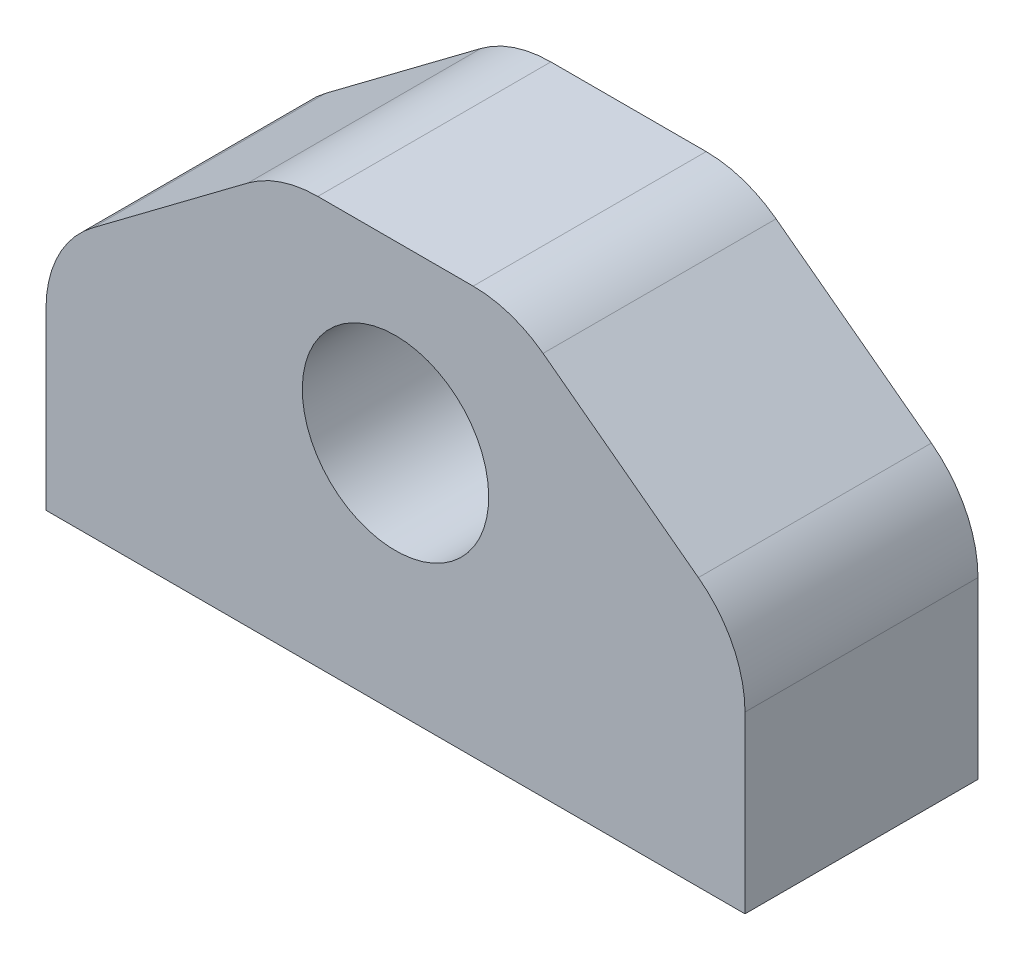
ISO-10303-21;
HEADER;
FILE_DESCRIPTION(('STEP AP214'),'2;1');
FILE_NAME('part.step','',(''),(''),'','','');
FILE_SCHEMA(('AUTOMOTIVE_DESIGN { 1 0 10303 214 1 1 1 1 }'));
ENDSEC;
DATA;
#1=APPLICATION_CONTEXT('core data for automotive mechanical design processes');
#2=APPLICATION_PROTOCOL_DEFINITION('international standard','automotive_design',2000,#1);
#3=PRODUCT_CONTEXT('',#1,'mechanical');
#4=PRODUCT('Part','Part','',(#3));
#5=PRODUCT_RELATED_PRODUCT_CATEGORY('part','',(#4));
#6=PRODUCT_DEFINITION_FORMATION('','',#4);
#7=PRODUCT_DEFINITION_CONTEXT('part definition',#1,'design');
#8=PRODUCT_DEFINITION('design','',#6,#7);
#9=PRODUCT_DEFINITION_SHAPE('','',#8);
#10=(LENGTH_UNIT() NAMED_UNIT(*) SI_UNIT(.MILLI.,.METRE.));
#11=(NAMED_UNIT(*) PLANE_ANGLE_UNIT() SI_UNIT($,.RADIAN.));
#12=(NAMED_UNIT(*) SI_UNIT($,.STERADIAN.) SOLID_ANGLE_UNIT());
#13=UNCERTAINTY_MEASURE_WITH_UNIT(LENGTH_MEASURE(1.E-05),#10,'distance_accuracy_value','');
#14=(GEOMETRIC_REPRESENTATION_CONTEXT(3) GLOBAL_UNCERTAINTY_ASSIGNED_CONTEXT((#13)) GLOBAL_UNIT_ASSIGNED_CONTEXT((#10,
#11,#12)) REPRESENTATION_CONTEXT('',''));
#15=CARTESIAN_POINT('',(0.,0.,0.));
#16=DIRECTION('',(0.,0.,1.));
#17=DIRECTION('',(1.,0.,0.));
#18=AXIS2_PLACEMENT_3D('',#15,#16,#17);
#19=CARTESIAN_POINT('',(-22.,20.,0.));
#20=DIRECTION('',(0.,1.,0.));
#21=DIRECTION('',(0.,0.,1.));
#22=AXIS2_PLACEMENT_3D('',#19,#20,#21);
#23=PLANE('',#22);
#24=CARTESIAN_POINT('',(-22.,20.,0.));
#25=DIRECTION('',(0.,-1.,0.));
#26=DIRECTION('',(0.,0.,-1.));
#27=AXIS2_PLACEMENT_3D('',#24,#25,#26);
#28=CIRCLE('',#27,3.00000000000001);
#29=CARTESIAN_POINT('',(-22.,20.,-3.00000000000001));
#30=VERTEX_POINT('',#29);
#31=EDGE_CURVE('E20',#30,#30,#28,.T.);
#32=ORIENTED_EDGE('',*,*,#31,.T.);
#33=EDGE_LOOP('',(#32));
#34=FACE_BOUND('',#33,.T.);
#35=ADVANCED_FACE('F17',(#34),#23,.F.);
#36=CARTESIAN_POINT('',(22.,20.,0.));
#37=DIRECTION('',(0.,1.,0.));
#38=DIRECTION('',(0.,0.,1.));
#39=AXIS2_PLACEMENT_3D('',#36,#37,#38);
#40=PLANE('',#39);
#41=CARTESIAN_POINT('',(22.,20.,0.));
#42=DIRECTION('',(0.,-1.,0.));
#43=DIRECTION('',(0.,0.,-1.));
#44=AXIS2_PLACEMENT_3D('',#41,#42,#43);
#45=CIRCLE('',#44,3.00000000000001);
#46=CARTESIAN_POINT('',(22.,20.,-3.00000000000001));
#47=VERTEX_POINT('',#46);
#48=EDGE_CURVE('E189',#47,#47,#45,.T.);
#49=ORIENTED_EDGE('',*,*,#48,.T.);
#50=EDGE_LOOP('',(#49));
#51=FACE_BOUND('',#50,.T.);
#52=ADVANCED_FACE('F201',(#51),#40,.F.);
#53=CARTESIAN_POINT('',(-22.,0.,0.));
#54=DIRECTION('',(0.,-1.,0.));
#55=DIRECTION('',(0.,0.,-1.));
#56=AXIS2_PLACEMENT_3D('',#53,#54,#55);
#57=CYLINDRICAL_SURFACE('',#56,3.00000000000001);
#58=ORIENTED_EDGE('',*,*,#31,.F.);
#59=EDGE_LOOP('',(#58));
#60=FACE_BOUND('',#59,.T.);
#61=CARTESIAN_POINT('',(-22.,0.,0.));
#62=DIRECTION('',(0.,-1.,0.));
#63=DIRECTION('',(0.,0.,-1.));
#64=AXIS2_PLACEMENT_3D('',#61,#62,#63);
#65=CIRCLE('',#64,3.00000000000001);
#66=CARTESIAN_POINT('',(-22.,0.,-3.00000000000001));
#67=VERTEX_POINT('',#66);
#68=EDGE_CURVE('E146',#67,#67,#65,.T.);
#69=ORIENTED_EDGE('',*,*,#68,.T.);
#70=EDGE_LOOP('',(#69));
#71=FACE_BOUND('',#70,.T.);
#72=ADVANCED_FACE('F197',(#60,#71),#57,.F.);
#73=CARTESIAN_POINT('',(22.,0.,0.));
#74=DIRECTION('',(0.,-1.,0.));
#75=DIRECTION('',(0.,0.,-1.));
#76=AXIS2_PLACEMENT_3D('',#73,#74,#75);
#77=CYLINDRICAL_SURFACE('',#76,3.00000000000001);
#78=ORIENTED_EDGE('',*,*,#48,.F.);
#79=EDGE_LOOP('',(#78));
#80=FACE_BOUND('',#79,.T.);
#81=CARTESIAN_POINT('',(22.,0.,0.));
#82=DIRECTION('',(0.,-1.,0.));
#83=DIRECTION('',(0.,0.,-1.));
#84=AXIS2_PLACEMENT_3D('',#81,#82,#83);
#85=CIRCLE('',#84,3.00000000000001);
#86=CARTESIAN_POINT('',(22.,0.,-3.00000000000001));
#87=VERTEX_POINT('',#86);
#88=EDGE_CURVE('E136',#87,#87,#85,.T.);
#89=ORIENTED_EDGE('',*,*,#88,.T.);
#90=EDGE_LOOP('',(#89));
#91=FACE_BOUND('',#90,.T.);
#92=ADVANCED_FACE('F200',(#80,#91),#77,.F.);
#93=CARTESIAN_POINT('',(-20.,15.,-10.));
#94=DIRECTION('',(0.,0.,1.));
#95=DIRECTION('',(1.,0.,0.));
#96=AXIS2_PLACEMENT_3D('',#93,#94,#95);
#97=PLANE('',#96);
#98=CARTESIAN_POINT('',(9.13592400663823E-11,19.9999999998882,-10.));
#99=DIRECTION('',(0.,0.,-1.));
#100=DIRECTION('',(0.,1.,0.));
#101=AXIS2_PLACEMENT_3D('',#98,#99,#100);
#102=CIRCLE('',#101,8.00000000000004);
#103=CARTESIAN_POINT('',(9.13592400663823E-11,27.9999999998883,-10.));
#104=VERTEX_POINT('',#103);
#105=EDGE_CURVE('E147',#104,#104,#102,.F.);
#106=ORIENTED_EDGE('',*,*,#105,.T.);
#107=EDGE_LOOP('',(#106));
#108=FACE_BOUND('',#107,.T.);
#109=CARTESIAN_POINT('',(-20.,15.,-10.));
#110=DIRECTION('',(0.,0.,-1.));
#111=DIRECTION('',(-1.,0.,0.));
#112=AXIS2_PLACEMENT_3D('',#109,#110,#111);
#113=CIRCLE('',#112,10.);
#114=CARTESIAN_POINT('',(-26.,23.,-10.));
#115=VERTEX_POINT('',#114);
#116=CARTESIAN_POINT('',(-30.,15.,-10.));
#117=VERTEX_POINT('',#116);
#118=EDGE_CURVE('E142',#115,#117,#113,.F.);
#119=ORIENTED_EDGE('',*,*,#118,.F.);
#120=DIRECTION('',(0.8,0.6,0.));
#121=VECTOR('',#120,1.);
#122=CARTESIAN_POINT('',(-12.6666666666667,33.,-10.));
#123=LINE('',#122,#121);
#124=CARTESIAN_POINT('',(-12.6666666666667,33.,-10.));
#125=VERTEX_POINT('',#124);
#126=EDGE_CURVE('E139',#115,#125,#123,.T.);
#127=ORIENTED_EDGE('',*,*,#126,.T.);
#128=CARTESIAN_POINT('',(-6.66666666666667,25.,-10.));
#129=DIRECTION('',(0.,0.,-1.));
#130=DIRECTION('',(-1.,0.,0.));
#131=AXIS2_PLACEMENT_3D('',#128,#129,#130);
#132=CIRCLE('',#131,10.);
#133=CARTESIAN_POINT('',(-6.66666666666667,35.,-10.));
#134=VERTEX_POINT('',#133);
#135=EDGE_CURVE('E153',#134,#125,#132,.F.);
#136=ORIENTED_EDGE('',*,*,#135,.F.);
#137=DIRECTION('',(1.,0.,0.));
#138=VECTOR('',#137,1.);
#139=CARTESIAN_POINT('',(-6.66666666666667,35.,-10.));
#140=LINE('',#139,#138);
#141=CARTESIAN_POINT('',(6.66666666666667,35.,-10.));
#142=VERTEX_POINT('',#141);
#143=EDGE_CURVE('E150',#134,#142,#140,.T.);
#144=ORIENTED_EDGE('',*,*,#143,.T.);
#145=CARTESIAN_POINT('',(6.66666666666667,25.,-10.));
#146=DIRECTION('',(0.,0.,-1.));
#147=DIRECTION('',(-1.,0.,0.));
#148=AXIS2_PLACEMENT_3D('',#145,#146,#147);
#149=CIRCLE('',#148,9.99999999999999);
#150=CARTESIAN_POINT('',(12.6666666666667,33.,-10.));
#151=VERTEX_POINT('',#150);
#152=EDGE_CURVE('E157',#151,#142,#149,.F.);
#153=ORIENTED_EDGE('',*,*,#152,.F.);
#154=DIRECTION('',(0.8,-0.6,0.));
#155=VECTOR('',#154,1.);
#156=CARTESIAN_POINT('',(12.6666666666667,33.,-10.));
#157=LINE('',#156,#155);
#158=CARTESIAN_POINT('',(26.,23.,-10.));
#159=VERTEX_POINT('',#158);
#160=EDGE_CURVE('E155',#151,#159,#157,.T.);
#161=ORIENTED_EDGE('',*,*,#160,.T.);
#162=CARTESIAN_POINT('',(20.,15.,-10.));
#163=DIRECTION('',(0.,0.,-1.));
#164=DIRECTION('',(-1.,0.,0.));
#165=AXIS2_PLACEMENT_3D('',#162,#163,#164);
#166=CIRCLE('',#165,10.);
#167=CARTESIAN_POINT('',(30.,15.,-10.));
#168=VERTEX_POINT('',#167);
#169=EDGE_CURVE('E87',#168,#159,#166,.F.);
#170=ORIENTED_EDGE('',*,*,#169,.F.);
#171=DIRECTION('',(0.,1.,0.));
#172=VECTOR('',#171,1.);
#173=CARTESIAN_POINT('',(30.,0.,-10.));
#174=LINE('',#173,#172);
#175=CARTESIAN_POINT('',(30.,0.,-10.));
#176=VERTEX_POINT('',#175);
#177=EDGE_CURVE('E111',#168,#176,#174,.F.);
#178=ORIENTED_EDGE('',*,*,#177,.T.);
#179=DIRECTION('',(1.,0.,0.));
#180=VECTOR('',#179,1.);
#181=CARTESIAN_POINT('',(-30.,0.,-10.));
#182=LINE('',#181,#180);
#183=CARTESIAN_POINT('',(-30.,0.,-10.));
#184=VERTEX_POINT('',#183);
#185=EDGE_CURVE('E95',#176,#184,#182,.F.);
#186=ORIENTED_EDGE('',*,*,#185,.T.);
#187=DIRECTION('',(0.,1.,0.));
#188=VECTOR('',#187,1.);
#189=CARTESIAN_POINT('',(-30.,0.,-10.));
#190=LINE('',#189,#188);
#191=EDGE_CURVE('E144',#184,#117,#190,.T.);
#192=ORIENTED_EDGE('',*,*,#191,.T.);
#193=EDGE_LOOP('',(#119,#127,#136,#144,#153,#161,#170,#178,#186,#192));
#194=FACE_BOUND('',#193,.T.);
#195=ADVANCED_FACE('F273',(#108,#194),#97,.F.);
#196=CARTESIAN_POINT('',(9.13722022878777E-11,19.9999999998883,-331.467770041911));
#197=DIRECTION('',(0.,0.,-1.));
#198=DIRECTION('',(0.,1.,0.));
#199=AXIS2_PLACEMENT_3D('',#196,#197,#198);
#200=CYLINDRICAL_SURFACE('',#199,8.00000000000004);
#201=ORIENTED_EDGE('',*,*,#105,.F.);
#202=EDGE_LOOP('',(#201));
#203=FACE_BOUND('',#202,.T.);
#204=CARTESIAN_POINT('',(9.13584336265023E-11,19.9999999998882,10.));
#205=DIRECTION('',(0.,0.,-1.));
#206=DIRECTION('',(0.,1.,0.));
#207=AXIS2_PLACEMENT_3D('',#204,#205,#206);
#208=CIRCLE('',#207,8.00000000000004);
#209=CARTESIAN_POINT('',(9.13584336265023E-11,27.9999999998883,10.));
#210=VERTEX_POINT('',#209);
#211=EDGE_CURVE('E128',#210,#210,#208,.T.);
#212=ORIENTED_EDGE('',*,*,#211,.F.);
#213=EDGE_LOOP('',(#212));
#214=FACE_BOUND('',#213,.T.);
#215=ADVANCED_FACE('F215',(#203,#214),#200,.F.);
#216=CARTESIAN_POINT('',(-30.,0.,10.));
#217=DIRECTION('',(1.,0.,0.));
#218=DIRECTION('',(0.,0.,-1.));
#219=AXIS2_PLACEMENT_3D('',#216,#217,#218);
#220=PLANE('',#219);
#221=DIRECTION('',(0.,0.,1.));
#222=VECTOR('',#221,1.);
#223=CARTESIAN_POINT('',(-30.,0.,10.));
#224=LINE('',#223,#222);
#225=CARTESIAN_POINT('',(-30.,0.,10.));
#226=VERTEX_POINT('',#225);
#227=EDGE_CURVE('E100',#184,#226,#224,.T.);
#228=ORIENTED_EDGE('',*,*,#227,.T.);
#229=DIRECTION('',(0.,1.,0.));
#230=VECTOR('',#229,1.);
#231=CARTESIAN_POINT('',(-30.,15.,10.));
#232=LINE('',#231,#230);
#233=CARTESIAN_POINT('',(-30.,15.,10.));
#234=VERTEX_POINT('',#233);
#235=EDGE_CURVE('E126',#234,#226,#232,.F.);
#236=ORIENTED_EDGE('',*,*,#235,.F.);
#237=DIRECTION('',(0.,0.,-1.));
#238=VECTOR('',#237,1.);
#239=CARTESIAN_POINT('',(-30.,15.,10.));
#240=LINE('',#239,#238);
#241=EDGE_CURVE('E178',#117,#234,#240,.F.);
#242=ORIENTED_EDGE('',*,*,#241,.F.);
#243=ORIENTED_EDGE('',*,*,#191,.F.);
#244=EDGE_LOOP('',(#228,#236,#242,#243));
#245=FACE_BOUND('',#244,.T.);
#246=ADVANCED_FACE('F206',(#245),#220,.F.);
#247=CARTESIAN_POINT('',(-30.,0.,10.));
#248=DIRECTION('',(0.,1.,0.));
#249=DIRECTION('',(0.,0.,1.));
#250=AXIS2_PLACEMENT_3D('',#247,#248,#249);
#251=PLANE('',#250);
#252=DIRECTION('',(0.,0.,1.));
#253=VECTOR('',#252,1.);
#254=CARTESIAN_POINT('',(30.,0.,10.));
#255=LINE('',#254,#253);
#256=CARTESIAN_POINT('',(30.,0.,10.));
#257=VERTEX_POINT('',#256);
#258=EDGE_CURVE('E103',#176,#257,#255,.T.);
#259=ORIENTED_EDGE('',*,*,#258,.T.);
#260=DIRECTION('',(1.,0.,0.));
#261=VECTOR('',#260,1.);
#262=CARTESIAN_POINT('',(-20.,0.,10.));
#263=LINE('',#262,#261);
#264=EDGE_CURVE('E108',#226,#257,#263,.T.);
#265=ORIENTED_EDGE('',*,*,#264,.F.);
#266=ORIENTED_EDGE('',*,*,#227,.F.);
#267=ORIENTED_EDGE('',*,*,#185,.F.);
#268=EDGE_LOOP('',(#259,#265,#266,#267));
#269=FACE_BOUND('',#268,.T.);
#270=ORIENTED_EDGE('',*,*,#88,.F.);
#271=EDGE_LOOP('',(#270));
#272=FACE_BOUND('',#271,.T.);
#273=ORIENTED_EDGE('',*,*,#68,.F.);
#274=EDGE_LOOP('',(#273));
#275=FACE_BOUND('',#274,.T.);
#276=ADVANCED_FACE('F105',(#269,#272,#275),#251,.F.);
#277=CARTESIAN_POINT('',(30.,0.,10.));
#278=DIRECTION('',(-1.,0.,0.));
#279=DIRECTION('',(0.,0.,1.));
#280=AXIS2_PLACEMENT_3D('',#277,#278,#279);
#281=PLANE('',#280);
#282=DIRECTION('',(0.,0.,-1.));
#283=VECTOR('',#282,1.);
#284=CARTESIAN_POINT('',(30.,15.,10.));
#285=LINE('',#284,#283);
#286=CARTESIAN_POINT('',(30.,15.,10.));
#287=VERTEX_POINT('',#286);
#288=EDGE_CURVE('E117',#287,#168,#285,.T.);
#289=ORIENTED_EDGE('',*,*,#288,.F.);
#290=DIRECTION('',(0.,1.,0.));
#291=VECTOR('',#290,1.);
#292=CARTESIAN_POINT('',(30.,15.,10.));
#293=LINE('',#292,#291);
#294=EDGE_CURVE('E114',#257,#287,#293,.T.);
#295=ORIENTED_EDGE('',*,*,#294,.F.);
#296=ORIENTED_EDGE('',*,*,#258,.F.);
#297=ORIENTED_EDGE('',*,*,#177,.F.);
#298=EDGE_LOOP('',(#289,#295,#296,#297));
#299=FACE_BOUND('',#298,.T.);
#300=ADVANCED_FACE('F115',(#299),#281,.F.);
#301=CARTESIAN_POINT('',(20.,15.,10.));
#302=DIRECTION('',(0.,0.,-1.));
#303=DIRECTION('',(-1.,0.,0.));
#304=AXIS2_PLACEMENT_3D('',#301,#302,#303);
#305=CYLINDRICAL_SURFACE('',#304,10.);
#306=CARTESIAN_POINT('',(20.,15.,10.));
#307=DIRECTION('',(0.,0.,-1.));
#308=DIRECTION('',(-1.,0.,0.));
#309=AXIS2_PLACEMENT_3D('',#306,#307,#308);
#310=CIRCLE('',#309,10.);
#311=CARTESIAN_POINT('',(26.,23.,10.));
#312=VERTEX_POINT('',#311);
#313=EDGE_CURVE('E121',#287,#312,#310,.F.);
#314=ORIENTED_EDGE('',*,*,#313,.F.);
#315=ORIENTED_EDGE('',*,*,#288,.T.);
#316=ORIENTED_EDGE('',*,*,#169,.T.);
#317=DIRECTION('',(0.,0.,1.));
#318=VECTOR('',#317,1.);
#319=CARTESIAN_POINT('',(26.,23.,10.));
#320=LINE('',#319,#318);
#321=EDGE_CURVE('E158',#159,#312,#320,.T.);
#322=ORIENTED_EDGE('',*,*,#321,.T.);
#323=EDGE_LOOP('',(#314,#315,#316,#322));
#324=FACE_BOUND('',#323,.T.);
#325=ADVANCED_FACE('F213',(#324),#305,.T.);
#326=CARTESIAN_POINT('',(12.6666666666667,33.,10.));
#327=DIRECTION('',(-0.6,-0.8,0.));
#328=DIRECTION('',(0.8,-0.6,0.));
#329=AXIS2_PLACEMENT_3D('',#326,#327,#328);
#330=PLANE('',#329);
#331=DIRECTION('',(0.,0.,-1.));
#332=VECTOR('',#331,1.);
#333=CARTESIAN_POINT('',(12.6666666666667,33.,10.));
#334=LINE('',#333,#332);
#335=CARTESIAN_POINT('',(12.6666666666667,33.,10.));
#336=VERTEX_POINT('',#335);
#337=EDGE_CURVE('E182',#336,#151,#334,.T.);
#338=ORIENTED_EDGE('',*,*,#337,.F.);
#339=DIRECTION('',(-0.8,0.599999999999999,0.));
#340=VECTOR('',#339,1.);
#341=CARTESIAN_POINT('',(26.,23.,10.));
#342=LINE('',#341,#340);
#343=EDGE_CURVE('E172',#312,#336,#342,.T.);
#344=ORIENTED_EDGE('',*,*,#343,.F.);
#345=ORIENTED_EDGE('',*,*,#321,.F.);
#346=ORIENTED_EDGE('',*,*,#160,.F.);
#347=EDGE_LOOP('',(#338,#344,#345,#346));
#348=FACE_BOUND('',#347,.T.);
#349=ADVANCED_FACE('F240',(#348),#330,.F.);
#350=CARTESIAN_POINT('',(6.66666666666667,25.,10.));
#351=DIRECTION('',(0.,0.,-1.));
#352=DIRECTION('',(-1.,0.,0.));
#353=AXIS2_PLACEMENT_3D('',#350,#351,#352);
#354=CYLINDRICAL_SURFACE('',#353,9.99999999999999);
#355=CARTESIAN_POINT('',(6.66666666666667,25.,10.));
#356=DIRECTION('',(0.,0.,-1.));
#357=DIRECTION('',(-1.,0.,0.));
#358=AXIS2_PLACEMENT_3D('',#355,#356,#357);
#359=CIRCLE('',#358,9.99999999999999);
#360=CARTESIAN_POINT('',(6.66666666666667,35.,10.));
#361=VERTEX_POINT('',#360);
#362=EDGE_CURVE('E169',#336,#361,#359,.F.);
#363=ORIENTED_EDGE('',*,*,#362,.F.);
#364=ORIENTED_EDGE('',*,*,#337,.T.);
#365=ORIENTED_EDGE('',*,*,#152,.T.);
#366=DIRECTION('',(0.,0.,-1.));
#367=VECTOR('',#366,1.);
#368=CARTESIAN_POINT('',(6.66666666666667,35.,10.));
#369=LINE('',#368,#367);
#370=EDGE_CURVE('E154',#142,#361,#369,.F.);
#371=ORIENTED_EDGE('',*,*,#370,.T.);
#372=EDGE_LOOP('',(#363,#364,#365,#371));
#373=FACE_BOUND('',#372,.T.);
#374=ADVANCED_FACE('F236',(#373),#354,.T.);
#375=CARTESIAN_POINT('',(-6.66666666666667,35.,10.));
#376=DIRECTION('',(0.,-1.,0.));
#377=DIRECTION('',(0.,0.,-1.));
#378=AXIS2_PLACEMENT_3D('',#375,#376,#377);
#379=PLANE('',#378);
#380=DIRECTION('',(0.,0.,-1.));
#381=VECTOR('',#380,1.);
#382=CARTESIAN_POINT('',(-6.66666666666667,35.,10.));
#383=LINE('',#382,#381);
#384=CARTESIAN_POINT('',(-6.66666666666667,35.,10.));
#385=VERTEX_POINT('',#384);
#386=EDGE_CURVE('E180',#385,#134,#383,.T.);
#387=ORIENTED_EDGE('',*,*,#386,.F.);
#388=DIRECTION('',(1.,0.,0.));
#389=VECTOR('',#388,1.);
#390=CARTESIAN_POINT('',(-20.,35.,10.));
#391=LINE('',#390,#389);
#392=EDGE_CURVE('E168',#361,#385,#391,.F.);
#393=ORIENTED_EDGE('',*,*,#392,.F.);
#394=ORIENTED_EDGE('',*,*,#370,.F.);
#395=ORIENTED_EDGE('',*,*,#143,.F.);
#396=EDGE_LOOP('',(#387,#393,#394,#395));
#397=FACE_BOUND('',#396,.T.);
#398=ADVANCED_FACE('F232',(#397),#379,.F.);
#399=CARTESIAN_POINT('',(-6.66666666666667,25.,10.));
#400=DIRECTION('',(0.,0.,-1.));
#401=DIRECTION('',(-1.,0.,0.));
#402=AXIS2_PLACEMENT_3D('',#399,#400,#401);
#403=CYLINDRICAL_SURFACE('',#402,10.);
#404=CARTESIAN_POINT('',(-6.66666666666667,25.,10.));
#405=DIRECTION('',(0.,0.,-1.));
#406=DIRECTION('',(-1.,0.,0.));
#407=AXIS2_PLACEMENT_3D('',#404,#405,#406);
#408=CIRCLE('',#407,10.);
#409=CARTESIAN_POINT('',(-12.6666666666667,33.,10.));
#410=VERTEX_POINT('',#409);
#411=EDGE_CURVE('E165',#385,#410,#408,.F.);
#412=ORIENTED_EDGE('',*,*,#411,.F.);
#413=ORIENTED_EDGE('',*,*,#386,.T.);
#414=ORIENTED_EDGE('',*,*,#135,.T.);
#415=DIRECTION('',(0.,0.,1.));
#416=VECTOR('',#415,1.);
#417=CARTESIAN_POINT('',(-12.6666666666667,33.,10.));
#418=LINE('',#417,#416);
#419=EDGE_CURVE('E143',#125,#410,#418,.T.);
#420=ORIENTED_EDGE('',*,*,#419,.T.);
#421=EDGE_LOOP('',(#412,#413,#414,#420));
#422=FACE_BOUND('',#421,.T.);
#423=ADVANCED_FACE('F229',(#422),#403,.T.);
#424=CARTESIAN_POINT('',(-12.6666666666667,33.,10.));
#425=DIRECTION('',(0.6,-0.8,0.));
#426=DIRECTION('',(0.8,0.6,0.));
#427=AXIS2_PLACEMENT_3D('',#424,#425,#426);
#428=PLANE('',#427);
#429=DIRECTION('',(0.,0.,-1.));
#430=VECTOR('',#429,1.);
#431=CARTESIAN_POINT('',(-26.,23.,10.));
#432=LINE('',#431,#430);
#433=CARTESIAN_POINT('',(-26.,23.,10.));
#434=VERTEX_POINT('',#433);
#435=EDGE_CURVE('E35',#434,#115,#432,.T.);
#436=ORIENTED_EDGE('',*,*,#435,.F.);
#437=DIRECTION('',(-0.8,-0.6,0.));
#438=VECTOR('',#437,1.);
#439=CARTESIAN_POINT('',(-12.6666666666667,33.,10.));
#440=LINE('',#439,#438);
#441=EDGE_CURVE('E26',#410,#434,#440,.T.);
#442=ORIENTED_EDGE('',*,*,#441,.F.);
#443=ORIENTED_EDGE('',*,*,#419,.F.);
#444=ORIENTED_EDGE('',*,*,#126,.F.);
#445=EDGE_LOOP('',(#436,#442,#443,#444));
#446=FACE_BOUND('',#445,.T.);
#447=ADVANCED_FACE('F223',(#446),#428,.F.);
#448=CARTESIAN_POINT('',(-20.,15.,10.));
#449=DIRECTION('',(0.,0.,-1.));
#450=DIRECTION('',(-1.,0.,0.));
#451=AXIS2_PLACEMENT_3D('',#448,#449,#450);
#452=CYLINDRICAL_SURFACE('',#451,10.);
#453=CARTESIAN_POINT('',(-20.,15.,10.));
#454=DIRECTION('',(0.,0.,-1.));
#455=DIRECTION('',(-1.,0.,0.));
#456=AXIS2_PLACEMENT_3D('',#453,#454,#455);
#457=CIRCLE('',#456,10.);
#458=EDGE_CURVE('E11',#434,#234,#457,.F.);
#459=ORIENTED_EDGE('',*,*,#458,.F.);
#460=ORIENTED_EDGE('',*,*,#435,.T.);
#461=ORIENTED_EDGE('',*,*,#118,.T.);
#462=ORIENTED_EDGE('',*,*,#241,.T.);
#463=EDGE_LOOP('',(#459,#460,#461,#462));
#464=FACE_BOUND('',#463,.T.);
#465=ADVANCED_FACE('F218',(#464),#452,.T.);
#466=CARTESIAN_POINT('',(-20.,15.,10.));
#467=DIRECTION('',(0.,0.,1.));
#468=DIRECTION('',(1.,0.,0.));
#469=AXIS2_PLACEMENT_3D('',#466,#467,#468);
#470=PLANE('',#469);
#471=ORIENTED_EDGE('',*,*,#441,.T.);
#472=ORIENTED_EDGE('',*,*,#458,.T.);
#473=ORIENTED_EDGE('',*,*,#235,.T.);
#474=ORIENTED_EDGE('',*,*,#264,.T.);
#475=ORIENTED_EDGE('',*,*,#294,.T.);
#476=ORIENTED_EDGE('',*,*,#313,.T.);
#477=ORIENTED_EDGE('',*,*,#343,.T.);
#478=ORIENTED_EDGE('',*,*,#362,.T.);
#479=ORIENTED_EDGE('',*,*,#392,.T.);
#480=ORIENTED_EDGE('',*,*,#411,.T.);
#481=EDGE_LOOP('',(#471,#472,#473,#474,#475,#476,#477,#478,#479,#480));
#482=FACE_BOUND('',#481,.T.);
#483=ORIENTED_EDGE('',*,*,#211,.T.);
#484=EDGE_LOOP('',(#483));
#485=FACE_BOUND('',#484,.T.);
#486=ADVANCED_FACE('F124',(#482,#485),#470,.T.);
#487=CLOSED_SHELL('',(#35,#52,#72,#92,#195,#215,#246,#276,#300,#325,#349,#374,#398,#423,#447,
#465,#486));
#488=MANIFOLD_SOLID_BREP('B1',#487);
#489=ADVANCED_BREP_SHAPE_REPRESENTATION('',(#18,#488),#14);
#490=SHAPE_DEFINITION_REPRESENTATION(#9,#489);
ENDSEC;
END-ISO-10303-21;
